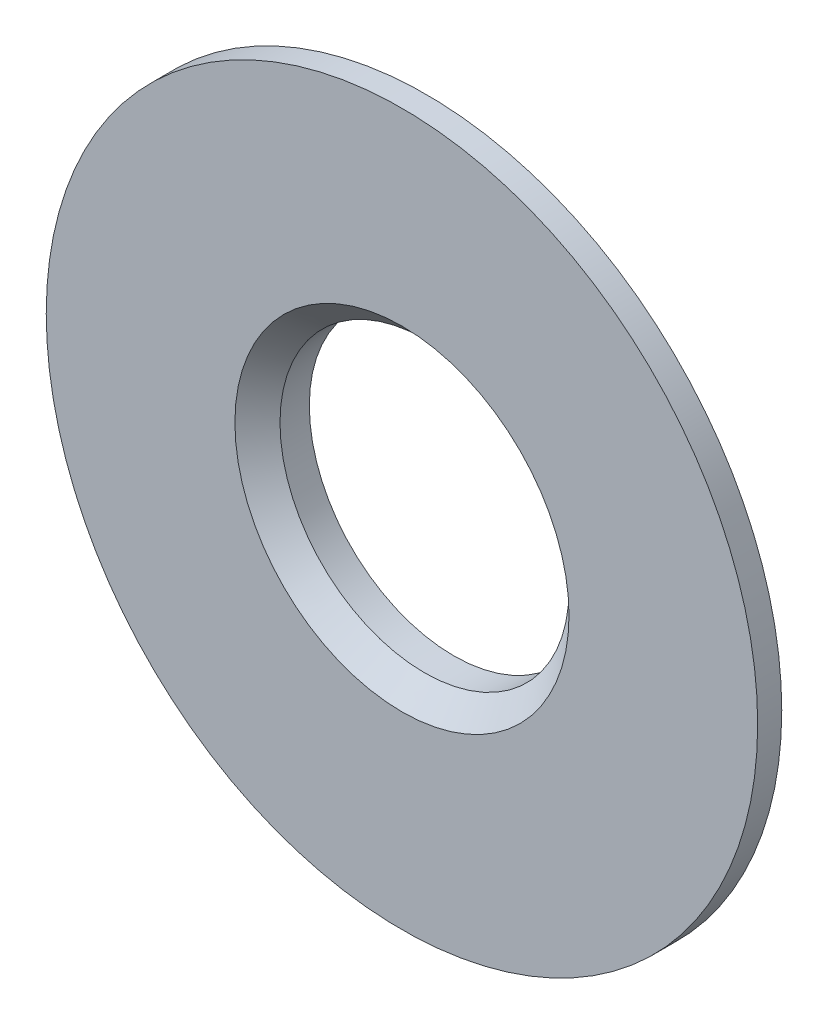
ISO-10303-21;
HEADER;
FILE_DESCRIPTION(('STEP AP214'),'2;1');
FILE_NAME('part.step','',(''),(''),'','','');
FILE_SCHEMA(('AUTOMOTIVE_DESIGN { 1 0 10303 214 1 1 1 1 }'));
ENDSEC;
DATA;
#1=APPLICATION_CONTEXT('core data for automotive mechanical design processes');
#2=APPLICATION_PROTOCOL_DEFINITION('international standard','automotive_design',2000,#1);
#3=PRODUCT_CONTEXT('',#1,'mechanical');
#4=PRODUCT('Part','Part','',(#3));
#5=PRODUCT_RELATED_PRODUCT_CATEGORY('part','',(#4));
#6=PRODUCT_DEFINITION_FORMATION('','',#4);
#7=PRODUCT_DEFINITION_CONTEXT('part definition',#1,'design');
#8=PRODUCT_DEFINITION('design','',#6,#7);
#9=PRODUCT_DEFINITION_SHAPE('','',#8);
#10=(LENGTH_UNIT() NAMED_UNIT(*) SI_UNIT(.MILLI.,.METRE.));
#11=(NAMED_UNIT(*) PLANE_ANGLE_UNIT() SI_UNIT($,.RADIAN.));
#12=(NAMED_UNIT(*) SI_UNIT($,.STERADIAN.) SOLID_ANGLE_UNIT());
#13=UNCERTAINTY_MEASURE_WITH_UNIT(LENGTH_MEASURE(1.E-05),#10,'distance_accuracy_value','');
#14=(GEOMETRIC_REPRESENTATION_CONTEXT(3) GLOBAL_UNCERTAINTY_ASSIGNED_CONTEXT((#13)) GLOBAL_UNIT_ASSIGNED_CONTEXT((#10,
#11,#12)) REPRESENTATION_CONTEXT('',''));
#15=CARTESIAN_POINT('',(0.,0.,0.));
#16=DIRECTION('',(0.,0.,1.));
#17=DIRECTION('',(1.,0.,0.));
#18=AXIS2_PLACEMENT_3D('',#15,#16,#17);
#19=CARTESIAN_POINT('',(0.,0.,0.));
#20=DIRECTION('',(0.,0.,-1.));
#21=DIRECTION('',(-1.,0.,0.));
#22=AXIS2_PLACEMENT_3D('',#19,#20,#21);
#23=CYLINDRICAL_SURFACE('',#22,38.);
#24=CARTESIAN_POINT('',(0.,0.,3.));
#25=DIRECTION('',(0.,0.,-1.));
#26=DIRECTION('',(-1.,0.,0.));
#27=AXIS2_PLACEMENT_3D('',#24,#25,#26);
#28=CIRCLE('',#27,38.);
#29=CARTESIAN_POINT('',(-38.,0.,3.));
#30=VERTEX_POINT('',#29);
#31=EDGE_CURVE('E64',#30,#30,#28,.T.);
#32=ORIENTED_EDGE('',*,*,#31,.T.);
#33=EDGE_LOOP('',(#32));
#34=FACE_BOUND('',#33,.T.);
#35=CARTESIAN_POINT('',(0.,0.,5.2));
#36=DIRECTION('',(0.,0.,-1.));
#37=DIRECTION('',(-1.,0.,0.));
#38=AXIS2_PLACEMENT_3D('',#35,#36,#37);
#39=CIRCLE('',#38,38.);
#40=CARTESIAN_POINT('',(-38.,0.,5.2));
#41=VERTEX_POINT('',#40);
#42=EDGE_CURVE('E10',#41,#41,#39,.T.);
#43=ORIENTED_EDGE('',*,*,#42,.F.);
#44=EDGE_LOOP('',(#43));
#45=FACE_BOUND('',#44,.T.);
#46=ADVANCED_FACE('F30',(#34,#45),#23,.F.);
#47=CARTESIAN_POINT('',(0.,18.2,5.2));
#48=DIRECTION('',(0.,0.,-1.));
#49=DIRECTION('',(-1.,0.,0.));
#50=AXIS2_PLACEMENT_3D('',#47,#48,#49);
#51=PLANE('',#50);
#52=ORIENTED_EDGE('',*,*,#42,.T.);
#53=EDGE_LOOP('',(#52));
#54=FACE_BOUND('',#53,.T.);
#55=CARTESIAN_POINT('',(0.,0.,5.2));
#56=DIRECTION('',(0.,0.,-1.));
#57=DIRECTION('',(-1.,0.,0.));
#58=AXIS2_PLACEMENT_3D('',#55,#56,#57);
#59=CIRCLE('',#58,18.2);
#60=CARTESIAN_POINT('',(-18.2,0.,5.2));
#61=VERTEX_POINT('',#60);
#62=EDGE_CURVE('E36',#61,#61,#59,.T.);
#63=ORIENTED_EDGE('',*,*,#62,.F.);
#64=EDGE_LOOP('',(#63));
#65=FACE_BOUND('',#64,.T.);
#66=ADVANCED_FACE('F114',(#54,#65),#51,.T.);
#67=CARTESIAN_POINT('',(0.,0.,3.));
#68=DIRECTION('',(0.,0.,1.));
#69=DIRECTION('',(1.,0.,0.));
#70=AXIS2_PLACEMENT_3D('',#67,#68,#69);
#71=CONICAL_SURFACE('',#70,16.,0.78539816339745);
#72=ORIENTED_EDGE('',*,*,#62,.T.);
#73=EDGE_LOOP('',(#72));
#74=FACE_BOUND('',#73,.T.);
#75=CARTESIAN_POINT('',(0.,0.,3.));
#76=DIRECTION('',(0.,0.,-1.));
#77=DIRECTION('',(-1.,0.,0.));
#78=AXIS2_PLACEMENT_3D('',#75,#76,#77);
#79=CIRCLE('',#78,16.);
#80=CARTESIAN_POINT('',(-16.,0.,3.));
#81=VERTEX_POINT('',#80);
#82=EDGE_CURVE('E40',#81,#81,#79,.T.);
#83=ORIENTED_EDGE('',*,*,#82,.F.);
#84=EDGE_LOOP('',(#83));
#85=FACE_BOUND('',#84,.T.);
#86=ADVANCED_FACE('F108',(#74,#85),#71,.T.);
#87=CARTESIAN_POINT('',(0.,0.,0.));
#88=DIRECTION('',(0.,0.,-1.));
#89=DIRECTION('',(-1.,0.,0.));
#90=AXIS2_PLACEMENT_3D('',#87,#88,#89);
#91=CYLINDRICAL_SURFACE('',#90,16.);
#92=ORIENTED_EDGE('',*,*,#82,.T.);
#93=EDGE_LOOP('',(#92));
#94=FACE_BOUND('',#93,.T.);
#95=CARTESIAN_POINT('',(0.,0.,0.));
#96=DIRECTION('',(0.,0.,-1.));
#97=DIRECTION('',(-1.,0.,0.));
#98=AXIS2_PLACEMENT_3D('',#95,#96,#97);
#99=CIRCLE('',#98,16.);
#100=CARTESIAN_POINT('',(-16.,0.,0.));
#101=VERTEX_POINT('',#100);
#102=EDGE_CURVE('E44',#101,#101,#99,.T.);
#103=ORIENTED_EDGE('',*,*,#102,.F.);
#104=EDGE_LOOP('',(#103));
#105=FACE_BOUND('',#104,.T.);
#106=ADVANCED_FACE('F103',(#94,#105),#91,.T.);
#107=CARTESIAN_POINT('',(0.,16.,0.));
#108=DIRECTION('',(0.,0.,1.));
#109=DIRECTION('',(1.,0.,0.));
#110=AXIS2_PLACEMENT_3D('',#107,#108,#109);
#111=PLANE('',#110);
#112=CARTESIAN_POINT('',(0.,0.,0.));
#113=DIRECTION('',(0.,0.,-1.));
#114=DIRECTION('',(-1.,0.,0.));
#115=AXIS2_PLACEMENT_3D('',#112,#113,#114);
#116=CIRCLE('',#115,15.6);
#117=CARTESIAN_POINT('',(-15.6,0.,0.));
#118=VERTEX_POINT('',#117);
#119=EDGE_CURVE('E49',#118,#118,#116,.T.);
#120=ORIENTED_EDGE('',*,*,#119,.F.);
#121=EDGE_LOOP('',(#120));
#122=FACE_BOUND('',#121,.T.);
#123=ORIENTED_EDGE('',*,*,#102,.T.);
#124=EDGE_LOOP('',(#123));
#125=FACE_BOUND('',#124,.T.);
#126=ADVANCED_FACE('F97',(#122,#125),#111,.F.);
#127=CARTESIAN_POINT('',(0.,0.,0.));
#128=DIRECTION('',(0.,0.,-1.));
#129=DIRECTION('',(-1.,0.,0.));
#130=AXIS2_PLACEMENT_3D('',#127,#128,#129);
#131=CYLINDRICAL_SURFACE('',#130,15.6);
#132=CARTESIAN_POINT('',(0.,0.,3.16568542494924));
#133=DIRECTION('',(0.,0.,-1.));
#134=DIRECTION('',(-1.,0.,0.));
#135=AXIS2_PLACEMENT_3D('',#132,#133,#134);
#136=CIRCLE('',#135,15.6);
#137=CARTESIAN_POINT('',(-15.6,0.,3.16568542494924));
#138=VERTEX_POINT('',#137);
#139=EDGE_CURVE('E52',#138,#138,#136,.T.);
#140=ORIENTED_EDGE('',*,*,#139,.F.);
#141=EDGE_LOOP('',(#140));
#142=FACE_BOUND('',#141,.T.);
#143=ORIENTED_EDGE('',*,*,#119,.T.);
#144=EDGE_LOOP('',(#143));
#145=FACE_BOUND('',#144,.T.);
#146=ADVANCED_FACE('F91',(#142,#145),#131,.F.);
#147=CARTESIAN_POINT('',(0.,0.,3.16568542494924));
#148=DIRECTION('',(0.,0.,1.));
#149=DIRECTION('',(1.,0.,0.));
#150=AXIS2_PLACEMENT_3D('',#147,#148,#149);
#151=CONICAL_SURFACE('',#150,15.6,0.78539816339745);
#152=CARTESIAN_POINT('',(0.,0.,5.6));
#153=DIRECTION('',(0.,0.,-1.));
#154=DIRECTION('',(-1.,0.,0.));
#155=AXIS2_PLACEMENT_3D('',#152,#153,#154);
#156=CIRCLE('',#155,18.0343145750508);
#157=CARTESIAN_POINT('',(-18.0343145750508,0.,5.6));
#158=VERTEX_POINT('',#157);
#159=EDGE_CURVE('E55',#158,#158,#156,.T.);
#160=ORIENTED_EDGE('',*,*,#159,.F.);
#161=EDGE_LOOP('',(#160));
#162=FACE_BOUND('',#161,.T.);
#163=ORIENTED_EDGE('',*,*,#139,.T.);
#164=EDGE_LOOP('',(#163));
#165=FACE_BOUND('',#164,.T.);
#166=ADVANCED_FACE('F85',(#162,#165),#151,.F.);
#167=CARTESIAN_POINT('',(0.,18.2,5.6));
#168=DIRECTION('',(0.,0.,-1.));
#169=DIRECTION('',(-1.,0.,0.));
#170=AXIS2_PLACEMENT_3D('',#167,#168,#169);
#171=PLANE('',#170);
#172=CARTESIAN_POINT('',(0.,0.,5.6));
#173=DIRECTION('',(0.,0.,-1.));
#174=DIRECTION('',(-1.,0.,0.));
#175=AXIS2_PLACEMENT_3D('',#172,#173,#174);
#176=CIRCLE('',#175,38.4);
#177=CARTESIAN_POINT('',(-38.4,0.,5.6));
#178=VERTEX_POINT('',#177);
#179=EDGE_CURVE('E58',#178,#178,#176,.T.);
#180=ORIENTED_EDGE('',*,*,#179,.F.);
#181=EDGE_LOOP('',(#180));
#182=FACE_BOUND('',#181,.T.);
#183=ORIENTED_EDGE('',*,*,#159,.T.);
#184=EDGE_LOOP('',(#183));
#185=FACE_BOUND('',#184,.T.);
#186=ADVANCED_FACE('F79',(#182,#185),#171,.F.);
#187=CARTESIAN_POINT('',(0.,0.,0.));
#188=DIRECTION('',(0.,0.,-1.));
#189=DIRECTION('',(-1.,0.,0.));
#190=AXIS2_PLACEMENT_3D('',#187,#188,#189);
#191=CYLINDRICAL_SURFACE('',#190,38.4);
#192=CARTESIAN_POINT('',(0.,0.,3.));
#193=DIRECTION('',(0.,0.,-1.));
#194=DIRECTION('',(-1.,0.,0.));
#195=AXIS2_PLACEMENT_3D('',#192,#193,#194);
#196=CIRCLE('',#195,38.4);
#197=CARTESIAN_POINT('',(-38.4,0.,3.));
#198=VERTEX_POINT('',#197);
#199=EDGE_CURVE('E61',#198,#198,#196,.T.);
#200=ORIENTED_EDGE('',*,*,#199,.F.);
#201=EDGE_LOOP('',(#200));
#202=FACE_BOUND('',#201,.T.);
#203=ORIENTED_EDGE('',*,*,#179,.T.);
#204=EDGE_LOOP('',(#203));
#205=FACE_BOUND('',#204,.T.);
#206=ADVANCED_FACE('F73',(#202,#205),#191,.T.);
#207=CARTESIAN_POINT('',(0.,38.4,3.));
#208=DIRECTION('',(0.,0.,1.));
#209=DIRECTION('',(1.,0.,0.));
#210=AXIS2_PLACEMENT_3D('',#207,#208,#209);
#211=PLANE('',#210);
#212=ORIENTED_EDGE('',*,*,#31,.F.);
#213=EDGE_LOOP('',(#212));
#214=FACE_BOUND('',#213,.T.);
#215=ORIENTED_EDGE('',*,*,#199,.T.);
#216=EDGE_LOOP('',(#215));
#217=FACE_BOUND('',#216,.T.);
#218=ADVANCED_FACE('F70',(#214,#217),#211,.F.);
#219=CLOSED_SHELL('',(#46,#66,#86,#106,#126,#146,#166,#186,#206,#218));
#220=MANIFOLD_SOLID_BREP('B2',#219);
#221=ADVANCED_BREP_SHAPE_REPRESENTATION('',(#18,#220),#14);
#222=SHAPE_DEFINITION_REPRESENTATION(#9,#221);
ENDSEC;
END-ISO-10303-21;
